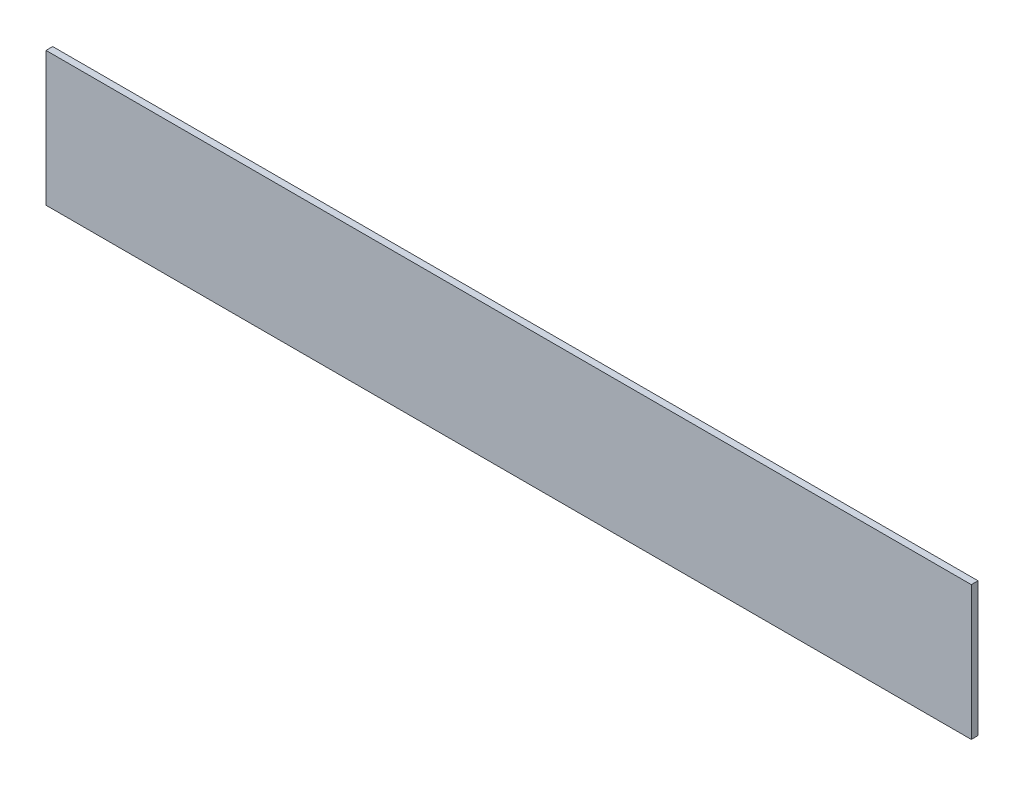
ISO-10303-21;
HEADER;
FILE_DESCRIPTION(('STEP AP214'),'2;1');
FILE_NAME('part.step','',(''),(''),'','','');
FILE_SCHEMA(('AUTOMOTIVE_DESIGN { 1 0 10303 214 1 1 1 1 }'));
ENDSEC;
DATA;
#1=APPLICATION_CONTEXT('core data for automotive mechanical design processes');
#2=APPLICATION_PROTOCOL_DEFINITION('international standard','automotive_design',2000,#1);
#3=PRODUCT_CONTEXT('',#1,'mechanical');
#4=PRODUCT('Part','Part','',(#3));
#5=PRODUCT_RELATED_PRODUCT_CATEGORY('part','',(#4));
#6=PRODUCT_DEFINITION_FORMATION('','',#4);
#7=PRODUCT_DEFINITION_CONTEXT('part definition',#1,'design');
#8=PRODUCT_DEFINITION('design','',#6,#7);
#9=PRODUCT_DEFINITION_SHAPE('','',#8);
#10=(LENGTH_UNIT() NAMED_UNIT(*) SI_UNIT(.MILLI.,.METRE.));
#11=(NAMED_UNIT(*) PLANE_ANGLE_UNIT() SI_UNIT($,.RADIAN.));
#12=(NAMED_UNIT(*) SI_UNIT($,.STERADIAN.) SOLID_ANGLE_UNIT());
#13=UNCERTAINTY_MEASURE_WITH_UNIT(LENGTH_MEASURE(1.E-05),#10,'distance_accuracy_value','');
#14=(GEOMETRIC_REPRESENTATION_CONTEXT(3) GLOBAL_UNCERTAINTY_ASSIGNED_CONTEXT((#13)) GLOBAL_UNIT_ASSIGNED_CONTEXT((#10,
#11,#12)) REPRESENTATION_CONTEXT('',''));
#15=CARTESIAN_POINT('',(0.,0.,0.));
#16=DIRECTION('',(0.,0.,1.));
#17=DIRECTION('',(1.,0.,0.));
#18=AXIS2_PLACEMENT_3D('',#15,#16,#17);
#19=CARTESIAN_POINT('',(690.,100.,10.));
#20=DIRECTION('',(-1.,0.,0.));
#21=DIRECTION('',(0.,0.,1.));
#22=AXIS2_PLACEMENT_3D('',#19,#20,#21);
#23=PLANE('',#22);
#24=DIRECTION('',(0.,1.,0.));
#25=VECTOR('',#24,1.);
#26=CARTESIAN_POINT('',(690.,100.,0.));
#27=LINE('',#26,#25);
#28=CARTESIAN_POINT('',(690.,-100.,0.));
#29=VERTEX_POINT('',#28);
#30=CARTESIAN_POINT('',(690.,100.,0.));
#31=VERTEX_POINT('',#30);
#32=EDGE_CURVE('E96',#29,#31,#27,.T.);
#33=ORIENTED_EDGE('',*,*,#32,.T.);
#34=DIRECTION('',(0.,0.,-1.));
#35=VECTOR('',#34,1.);
#36=CARTESIAN_POINT('',(690.,100.,10.));
#37=LINE('',#36,#35);
#38=CARTESIAN_POINT('',(690.,100.,10.));
#39=VERTEX_POINT('',#38);
#40=EDGE_CURVE('E11',#39,#31,#37,.T.);
#41=ORIENTED_EDGE('',*,*,#40,.F.);
#42=DIRECTION('',(0.,1.,0.));
#43=VECTOR('',#42,1.);
#44=CARTESIAN_POINT('',(690.,100.,10.));
#45=LINE('',#44,#43);
#46=CARTESIAN_POINT('',(690.,-100.,10.));
#47=VERTEX_POINT('',#46);
#48=EDGE_CURVE('E84',#47,#39,#45,.T.);
#49=ORIENTED_EDGE('',*,*,#48,.F.);
#50=DIRECTION('',(0.,0.,-1.));
#51=VECTOR('',#50,1.);
#52=CARTESIAN_POINT('',(690.,-100.,10.));
#53=LINE('',#52,#51);
#54=EDGE_CURVE('E92',#47,#29,#53,.T.);
#55=ORIENTED_EDGE('',*,*,#54,.T.);
#56=EDGE_LOOP('',(#33,#41,#49,#55));
#57=FACE_BOUND('',#56,.T.);
#58=ADVANCED_FACE('F33',(#57),#23,.F.);
#59=CARTESIAN_POINT('',(-690.,100.,10.));
#60=DIRECTION('',(0.,-1.,0.));
#61=DIRECTION('',(0.,0.,-1.));
#62=AXIS2_PLACEMENT_3D('',#59,#60,#61);
#63=PLANE('',#62);
#64=DIRECTION('',(-1.,0.,0.));
#65=VECTOR('',#64,1.);
#66=CARTESIAN_POINT('',(-690.,100.,0.));
#67=LINE('',#66,#65);
#68=CARTESIAN_POINT('',(-690.,100.,0.));
#69=VERTEX_POINT('',#68);
#70=EDGE_CURVE('E88',#31,#69,#67,.T.);
#71=ORIENTED_EDGE('',*,*,#70,.T.);
#72=DIRECTION('',(0.,0.,-1.));
#73=VECTOR('',#72,1.);
#74=CARTESIAN_POINT('',(-690.,100.,10.));
#75=LINE('',#74,#73);
#76=CARTESIAN_POINT('',(-690.,100.,10.));
#77=VERTEX_POINT('',#76);
#78=EDGE_CURVE('E41',#77,#69,#75,.T.);
#79=ORIENTED_EDGE('',*,*,#78,.F.);
#80=DIRECTION('',(-1.,0.,0.));
#81=VECTOR('',#80,1.);
#82=CARTESIAN_POINT('',(-690.,100.,10.));
#83=LINE('',#82,#81);
#84=EDGE_CURVE('E79',#39,#77,#83,.T.);
#85=ORIENTED_EDGE('',*,*,#84,.F.);
#86=ORIENTED_EDGE('',*,*,#40,.T.);
#87=EDGE_LOOP('',(#71,#79,#85,#86));
#88=FACE_BOUND('',#87,.T.);
#89=ADVANCED_FACE('F87',(#88),#63,.F.);
#90=CARTESIAN_POINT('',(-690.,100.,10.));
#91=DIRECTION('',(1.,0.,0.));
#92=DIRECTION('',(0.,0.,-1.));
#93=AXIS2_PLACEMENT_3D('',#90,#91,#92);
#94=PLANE('',#93);
#95=DIRECTION('',(0.,-1.,0.));
#96=VECTOR('',#95,1.);
#97=CARTESIAN_POINT('',(-690.,100.,0.));
#98=LINE('',#97,#96);
#99=CARTESIAN_POINT('',(-690.,-100.,0.));
#100=VERTEX_POINT('',#99);
#101=EDGE_CURVE('E66',#69,#100,#98,.T.);
#102=ORIENTED_EDGE('',*,*,#101,.T.);
#103=DIRECTION('',(0.,0.,-1.));
#104=VECTOR('',#103,1.);
#105=CARTESIAN_POINT('',(-690.,-100.,10.));
#106=LINE('',#105,#104);
#107=CARTESIAN_POINT('',(-690.,-100.,10.));
#108=VERTEX_POINT('',#107);
#109=EDGE_CURVE('E89',#108,#100,#106,.T.);
#110=ORIENTED_EDGE('',*,*,#109,.F.);
#111=DIRECTION('',(0.,-1.,0.));
#112=VECTOR('',#111,1.);
#113=CARTESIAN_POINT('',(-690.,100.,10.));
#114=LINE('',#113,#112);
#115=EDGE_CURVE('E82',#77,#108,#114,.T.);
#116=ORIENTED_EDGE('',*,*,#115,.F.);
#117=ORIENTED_EDGE('',*,*,#78,.T.);
#118=EDGE_LOOP('',(#102,#110,#116,#117));
#119=FACE_BOUND('',#118,.T.);
#120=ADVANCED_FACE('F90',(#119),#94,.F.);
#121=CARTESIAN_POINT('',(-690.,-100.,10.));
#122=DIRECTION('',(0.,1.,0.));
#123=DIRECTION('',(0.,0.,1.));
#124=AXIS2_PLACEMENT_3D('',#121,#122,#123);
#125=PLANE('',#124);
#126=DIRECTION('',(1.,0.,0.));
#127=VECTOR('',#126,1.);
#128=CARTESIAN_POINT('',(-690.,-100.,0.));
#129=LINE('',#128,#127);
#130=EDGE_CURVE('E72',#100,#29,#129,.T.);
#131=ORIENTED_EDGE('',*,*,#130,.T.);
#132=ORIENTED_EDGE('',*,*,#54,.F.);
#133=DIRECTION('',(1.,0.,0.));
#134=VECTOR('',#133,1.);
#135=CARTESIAN_POINT('',(-690.,-100.,10.));
#136=LINE('',#135,#134);
#137=EDGE_CURVE('E49',#108,#47,#136,.T.);
#138=ORIENTED_EDGE('',*,*,#137,.F.);
#139=ORIENTED_EDGE('',*,*,#109,.T.);
#140=EDGE_LOOP('',(#131,#132,#138,#139));
#141=FACE_BOUND('',#140,.T.);
#142=ADVANCED_FACE('F103',(#141),#125,.F.);
#143=CARTESIAN_POINT('',(0.,0.,10.));
#144=DIRECTION('',(0.,0.,1.));
#145=DIRECTION('',(1.,0.,0.));
#146=AXIS2_PLACEMENT_3D('',#143,#144,#145);
#147=PLANE('',#146);
#148=ORIENTED_EDGE('',*,*,#48,.T.);
#149=ORIENTED_EDGE('',*,*,#84,.T.);
#150=ORIENTED_EDGE('',*,*,#115,.T.);
#151=ORIENTED_EDGE('',*,*,#137,.T.);
#152=EDGE_LOOP('',(#148,#149,#150,#151));
#153=FACE_BOUND('',#152,.T.);
#154=ADVANCED_FACE('F80',(#153),#147,.T.);
#155=CARTESIAN_POINT('',(0.,0.,0.));
#156=DIRECTION('',(0.,0.,1.));
#157=DIRECTION('',(1.,0.,0.));
#158=AXIS2_PLACEMENT_3D('',#155,#156,#157);
#159=PLANE('',#158);
#160=ORIENTED_EDGE('',*,*,#32,.F.);
#161=ORIENTED_EDGE('',*,*,#130,.F.);
#162=ORIENTED_EDGE('',*,*,#101,.F.);
#163=ORIENTED_EDGE('',*,*,#70,.F.);
#164=EDGE_LOOP('',(#160,#161,#162,#163));
#165=FACE_BOUND('',#164,.T.);
#166=ADVANCED_FACE('F106',(#165),#159,.F.);
#167=CLOSED_SHELL('',(#58,#89,#120,#142,#154,#166));
#168=MANIFOLD_SOLID_BREP('B2',#167);
#169=ADVANCED_BREP_SHAPE_REPRESENTATION('',(#18,#168),#14);
#170=SHAPE_DEFINITION_REPRESENTATION(#9,#169);
ENDSEC;
END-ISO-10303-21;
